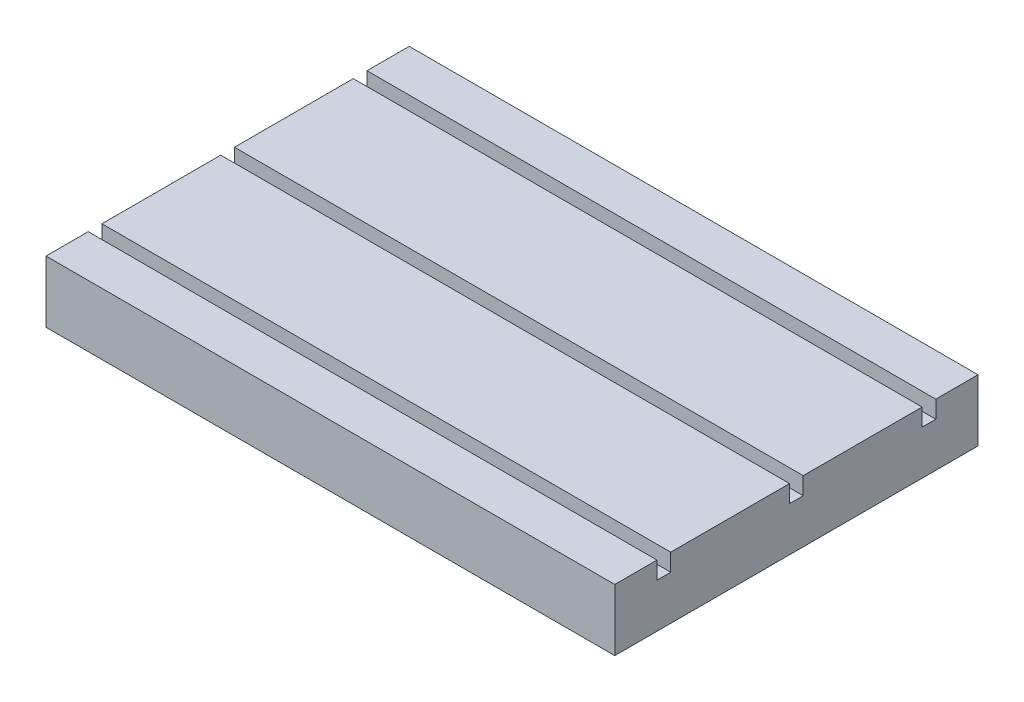
ISO-10303-21;
HEADER;
FILE_DESCRIPTION(('STEP AP214'),'2;1');
FILE_NAME('part.step','',(''),(''),'','','');
FILE_SCHEMA(('AUTOMOTIVE_DESIGN { 1 0 10303 214 1 1 1 1 }'));
ENDSEC;
DATA;
#1=APPLICATION_CONTEXT('core data for automotive mechanical design processes');
#2=APPLICATION_PROTOCOL_DEFINITION('international standard','automotive_design',2000,#1);
#3=PRODUCT_CONTEXT('',#1,'mechanical');
#4=PRODUCT('Part','Part','',(#3));
#5=PRODUCT_RELATED_PRODUCT_CATEGORY('part','',(#4));
#6=PRODUCT_DEFINITION_FORMATION('','',#4);
#7=PRODUCT_DEFINITION_CONTEXT('part definition',#1,'design');
#8=PRODUCT_DEFINITION('design','',#6,#7);
#9=PRODUCT_DEFINITION_SHAPE('','',#8);
#10=(LENGTH_UNIT() NAMED_UNIT(*) SI_UNIT(.MILLI.,.METRE.));
#11=(NAMED_UNIT(*) PLANE_ANGLE_UNIT() SI_UNIT($,.RADIAN.));
#12=(NAMED_UNIT(*) SI_UNIT($,.STERADIAN.) SOLID_ANGLE_UNIT());
#13=UNCERTAINTY_MEASURE_WITH_UNIT(LENGTH_MEASURE(1.E-05),#10,'distance_accuracy_value','');
#14=(GEOMETRIC_REPRESENTATION_CONTEXT(3) GLOBAL_UNCERTAINTY_ASSIGNED_CONTEXT((#13)) GLOBAL_UNIT_ASSIGNED_CONTEXT((#10,
#11,#12)) REPRESENTATION_CONTEXT('',''));
#15=CARTESIAN_POINT('',(0.,0.,0.));
#16=DIRECTION('',(0.,0.,1.));
#17=DIRECTION('',(1.,0.,0.));
#18=AXIS2_PLACEMENT_3D('',#15,#16,#17);
#19=CARTESIAN_POINT('',(0.,9.,0.));
#20=DIRECTION('',(1.,0.,0.));
#21=DIRECTION('',(0.,0.,-1.));
#22=AXIS2_PLACEMENT_3D('',#19,#20,#21);
#23=PLANE('',#22);
#24=DIRECTION('',(0.,1.,0.));
#25=VECTOR('',#24,1.);
#26=CARTESIAN_POINT('',(0.,6.46,25.5));
#27=LINE('',#26,#25);
#28=CARTESIAN_POINT('',(0.,6.46,25.5));
#29=VERTEX_POINT('',#28);
#30=CARTESIAN_POINT('',(0.,9.,25.5));
#31=VERTEX_POINT('',#30);
#32=EDGE_CURVE('E255',#29,#31,#27,.T.);
#33=ORIENTED_EDGE('',*,*,#32,.T.);
#34=DIRECTION('',(0.,0.,1.));
#35=VECTOR('',#34,1.);
#36=CARTESIAN_POINT('',(0.,9.,0.));
#37=LINE('',#36,#35);
#38=CARTESIAN_POINT('',(0.,9.,8.15934037097278));
#39=VERTEX_POINT('',#38);
#40=EDGE_CURVE('E190',#39,#31,#37,.T.);
#41=ORIENTED_EDGE('',*,*,#40,.F.);
#42=DIRECTION('',(0.,1.,0.));
#43=VECTOR('',#42,1.);
#44=CARTESIAN_POINT('',(0.,6.46,8.15934037097278));
#45=LINE('',#44,#43);
#46=CARTESIAN_POINT('',(0.,6.46,8.15934037097278));
#47=VERTEX_POINT('',#46);
#48=EDGE_CURVE('E57',#47,#39,#45,.T.);
#49=ORIENTED_EDGE('',*,*,#48,.F.);
#50=DIRECTION('',(0.,0.,1.));
#51=VECTOR('',#50,1.);
#52=CARTESIAN_POINT('',(0.,6.46,6.15934037097278));
#53=LINE('',#52,#51);
#54=CARTESIAN_POINT('',(0.,6.46,6.15934037097278));
#55=VERTEX_POINT('',#54);
#56=EDGE_CURVE('E221',#55,#47,#53,.T.);
#57=ORIENTED_EDGE('',*,*,#56,.F.);
#58=DIRECTION('',(0.,1.,0.));
#59=VECTOR('',#58,1.);
#60=CARTESIAN_POINT('',(0.,6.46,6.15934037097278));
#61=LINE('',#60,#59);
#62=CARTESIAN_POINT('',(0.,9.,6.15934037097278));
#63=VERTEX_POINT('',#62);
#64=EDGE_CURVE('E235',#55,#63,#61,.T.);
#65=ORIENTED_EDGE('',*,*,#64,.T.);
#66=CARTESIAN_POINT('',(0.,9.,0.));
#67=VERTEX_POINT('',#66);
#68=EDGE_CURVE('E185',#67,#63,#37,.T.);
#69=ORIENTED_EDGE('',*,*,#68,.F.);
#70=DIRECTION('',(0.,-1.,0.));
#71=VECTOR('',#70,1.);
#72=CARTESIAN_POINT('',(0.,9.,0.));
#73=LINE('',#72,#71);
#74=CARTESIAN_POINT('',(0.,0.,0.));
#75=VERTEX_POINT('',#74);
#76=EDGE_CURVE('E279',#67,#75,#73,.T.);
#77=ORIENTED_EDGE('',*,*,#76,.T.);
#78=DIRECTION('',(0.,0.,1.));
#79=VECTOR('',#78,1.);
#80=CARTESIAN_POINT('',(0.,0.,0.));
#81=LINE('',#80,#79);
#82=CARTESIAN_POINT('',(0.,0.,53.));
#83=VERTEX_POINT('',#82);
#84=EDGE_CURVE('E198',#75,#83,#81,.T.);
#85=ORIENTED_EDGE('',*,*,#84,.T.);
#86=DIRECTION('',(0.,-1.,0.));
#87=VECTOR('',#86,1.);
#88=CARTESIAN_POINT('',(0.,9.,53.));
#89=LINE('',#88,#87);
#90=CARTESIAN_POINT('',(0.,9.,53.));
#91=VERTEX_POINT('',#90);
#92=EDGE_CURVE('E11',#91,#83,#89,.T.);
#93=ORIENTED_EDGE('',*,*,#92,.F.);
#94=CARTESIAN_POINT('',(0.,9.,46.8406596290272));
#95=VERTEX_POINT('',#94);
#96=EDGE_CURVE('E193',#95,#91,#37,.T.);
#97=ORIENTED_EDGE('',*,*,#96,.F.);
#98=DIRECTION('',(0.,1.,0.));
#99=VECTOR('',#98,1.);
#100=CARTESIAN_POINT('',(0.,6.46,46.8406596290272));
#101=LINE('',#100,#99);
#102=CARTESIAN_POINT('',(0.,6.46,46.8406596290272));
#103=VERTEX_POINT('',#102);
#104=EDGE_CURVE('E204',#103,#95,#101,.T.);
#105=ORIENTED_EDGE('',*,*,#104,.F.);
#106=DIRECTION('',(0.,0.,-1.));
#107=VECTOR('',#106,1.);
#108=CARTESIAN_POINT('',(0.,6.46,46.8406596290272));
#109=LINE('',#108,#107);
#110=CARTESIAN_POINT('',(0.,6.46,44.8406596290272));
#111=VERTEX_POINT('',#110);
#112=EDGE_CURVE('E209',#103,#111,#109,.T.);
#113=ORIENTED_EDGE('',*,*,#112,.T.);
#114=DIRECTION('',(0.,1.,0.));
#115=VECTOR('',#114,1.);
#116=CARTESIAN_POINT('',(0.,6.46,44.8406596290272));
#117=LINE('',#116,#115);
#118=CARTESIAN_POINT('',(0.,9.,44.8406596290272));
#119=VERTEX_POINT('',#118);
#120=EDGE_CURVE('E195',#111,#119,#117,.T.);
#121=ORIENTED_EDGE('',*,*,#120,.T.);
#122=CARTESIAN_POINT('',(0.,9.,27.5));
#123=VERTEX_POINT('',#122);
#124=EDGE_CURVE('E192',#123,#119,#37,.T.);
#125=ORIENTED_EDGE('',*,*,#124,.F.);
#126=DIRECTION('',(0.,1.,0.));
#127=VECTOR('',#126,1.);
#128=CARTESIAN_POINT('',(0.,6.46,27.5));
#129=LINE('',#128,#127);
#130=CARTESIAN_POINT('',(0.,6.46,27.5));
#131=VERTEX_POINT('',#130);
#132=EDGE_CURVE('E49',#131,#123,#129,.T.);
#133=ORIENTED_EDGE('',*,*,#132,.F.);
#134=DIRECTION('',(0.,0.,-1.));
#135=VECTOR('',#134,1.);
#136=CARTESIAN_POINT('',(0.,6.46,27.5));
#137=LINE('',#136,#135);
#138=EDGE_CURVE('E155',#131,#29,#137,.T.);
#139=ORIENTED_EDGE('',*,*,#138,.T.);
#140=EDGE_LOOP('',(#33,#41,#49,#57,#65,#69,#77,#85,#93,#97,#105,#113,#121,#125,#133,#139));
#141=FACE_BOUND('',#140,.T.);
#142=ADVANCED_FACE('F35',(#141),#23,.F.);
#143=CARTESIAN_POINT('',(83.,9.,0.));
#144=DIRECTION('',(-1.,0.,0.));
#145=DIRECTION('',(0.,0.,1.));
#146=AXIS2_PLACEMENT_3D('',#143,#144,#145);
#147=PLANE('',#146);
#148=DIRECTION('',(0.,1.,0.));
#149=VECTOR('',#148,1.);
#150=CARTESIAN_POINT('',(83.,6.46,25.5));
#151=LINE('',#150,#149);
#152=CARTESIAN_POINT('',(83.,6.46,25.5));
#153=VERTEX_POINT('',#152);
#154=CARTESIAN_POINT('',(83.,9.,25.5));
#155=VERTEX_POINT('',#154);
#156=EDGE_CURVE('E166',#153,#155,#151,.T.);
#157=ORIENTED_EDGE('',*,*,#156,.F.);
#158=DIRECTION('',(0.,0.,-1.));
#159=VECTOR('',#158,1.);
#160=CARTESIAN_POINT('',(83.,6.46,26.5));
#161=LINE('',#160,#159);
#162=CARTESIAN_POINT('',(82.9999999999999,6.46,27.5));
#163=VERTEX_POINT('',#162);
#164=EDGE_CURVE('E165',#163,#153,#161,.T.);
#165=ORIENTED_EDGE('',*,*,#164,.F.);
#166=DIRECTION('',(0.,1.,0.));
#167=VECTOR('',#166,1.);
#168=CARTESIAN_POINT('',(82.9999999999999,6.46,27.5));
#169=LINE('',#168,#167);
#170=CARTESIAN_POINT('',(82.9999999999999,9.,27.5));
#171=VERTEX_POINT('',#170);
#172=EDGE_CURVE('E149',#163,#171,#169,.T.);
#173=ORIENTED_EDGE('',*,*,#172,.T.);
#174=DIRECTION('',(0.,0.,-1.));
#175=VECTOR('',#174,1.);
#176=CARTESIAN_POINT('',(83.,9.,0.));
#177=LINE('',#176,#175);
#178=CARTESIAN_POINT('',(82.9999999999999,9.,44.8406596290272));
#179=VERTEX_POINT('',#178);
#180=EDGE_CURVE('E163',#179,#171,#177,.T.);
#181=ORIENTED_EDGE('',*,*,#180,.F.);
#182=DIRECTION('',(0.,1.,0.));
#183=VECTOR('',#182,1.);
#184=CARTESIAN_POINT('',(82.9999999999999,6.46,44.8406596290272));
#185=LINE('',#184,#183);
#186=CARTESIAN_POINT('',(82.9999999999999,6.46,44.8406596290272));
#187=VERTEX_POINT('',#186);
#188=EDGE_CURVE('E199',#187,#179,#185,.T.);
#189=ORIENTED_EDGE('',*,*,#188,.F.);
#190=DIRECTION('',(0.,0.,-1.));
#191=VECTOR('',#190,1.);
#192=CARTESIAN_POINT('',(82.9999999999999,6.46,46.8406596290272));
#193=LINE('',#192,#191);
#194=CARTESIAN_POINT('',(82.9999999999999,6.46,46.8406596290272));
#195=VERTEX_POINT('',#194);
#196=EDGE_CURVE('E214',#195,#187,#193,.T.);
#197=ORIENTED_EDGE('',*,*,#196,.F.);
#198=DIRECTION('',(0.,1.,0.));
#199=VECTOR('',#198,1.);
#200=CARTESIAN_POINT('',(82.9999999999999,6.46,46.8406596290272));
#201=LINE('',#200,#199);
#202=CARTESIAN_POINT('',(82.9999999999999,9.,46.8406596290272));
#203=VERTEX_POINT('',#202);
#204=EDGE_CURVE('E201',#195,#203,#201,.T.);
#205=ORIENTED_EDGE('',*,*,#204,.T.);
#206=CARTESIAN_POINT('',(83.,9.,53.));
#207=VERTEX_POINT('',#206);
#208=EDGE_CURVE('E172',#207,#203,#177,.T.);
#209=ORIENTED_EDGE('',*,*,#208,.F.);
#210=DIRECTION('',(0.,-1.,0.));
#211=VECTOR('',#210,1.);
#212=CARTESIAN_POINT('',(83.,9.,53.));
#213=LINE('',#212,#211);
#214=CARTESIAN_POINT('',(83.,0.,53.));
#215=VERTEX_POINT('',#214);
#216=EDGE_CURVE('E42',#207,#215,#213,.T.);
#217=ORIENTED_EDGE('',*,*,#216,.T.);
#218=DIRECTION('',(0.,0.,-1.));
#219=VECTOR('',#218,1.);
#220=CARTESIAN_POINT('',(83.,0.,0.));
#221=LINE('',#220,#219);
#222=CARTESIAN_POINT('',(83.,0.,0.));
#223=VERTEX_POINT('',#222);
#224=EDGE_CURVE('E268',#215,#223,#221,.T.);
#225=ORIENTED_EDGE('',*,*,#224,.T.);
#226=DIRECTION('',(0.,-1.,0.));
#227=VECTOR('',#226,1.);
#228=CARTESIAN_POINT('',(83.,9.,0.));
#229=LINE('',#228,#227);
#230=CARTESIAN_POINT('',(83.,9.,0.));
#231=VERTEX_POINT('',#230);
#232=EDGE_CURVE('E281',#231,#223,#229,.T.);
#233=ORIENTED_EDGE('',*,*,#232,.F.);
#234=CARTESIAN_POINT('',(83.,9.,6.15934037097278));
#235=VERTEX_POINT('',#234);
#236=EDGE_CURVE('E175',#235,#231,#177,.T.);
#237=ORIENTED_EDGE('',*,*,#236,.F.);
#238=DIRECTION('',(0.,1.,0.));
#239=VECTOR('',#238,1.);
#240=CARTESIAN_POINT('',(83.,6.46,6.15934037097278));
#241=LINE('',#240,#239);
#242=CARTESIAN_POINT('',(83.,6.46,6.15934037097278));
#243=VERTEX_POINT('',#242);
#244=EDGE_CURVE('E238',#243,#235,#241,.T.);
#245=ORIENTED_EDGE('',*,*,#244,.F.);
#246=DIRECTION('',(0.,0.,1.));
#247=VECTOR('',#246,1.);
#248=CARTESIAN_POINT('',(83.,6.46,6.15934037097278));
#249=LINE('',#248,#247);
#250=CARTESIAN_POINT('',(83.,6.46,8.15934037097278));
#251=VERTEX_POINT('',#250);
#252=EDGE_CURVE('E228',#243,#251,#249,.T.);
#253=ORIENTED_EDGE('',*,*,#252,.T.);
#254=DIRECTION('',(0.,1.,0.));
#255=VECTOR('',#254,1.);
#256=CARTESIAN_POINT('',(83.,6.46,8.15934037097278));
#257=LINE('',#256,#255);
#258=CARTESIAN_POINT('',(83.,9.,8.15934037097278));
#259=VERTEX_POINT('',#258);
#260=EDGE_CURVE('E240',#251,#259,#257,.T.);
#261=ORIENTED_EDGE('',*,*,#260,.T.);
#262=EDGE_CURVE('E173',#155,#259,#177,.T.);
#263=ORIENTED_EDGE('',*,*,#262,.F.);
#264=EDGE_LOOP('',(#157,#165,#173,#181,#189,#197,#205,#209,#217,#225,#233,#237,#245,#253,#261,#263));
#265=FACE_BOUND('',#264,.T.);
#266=ADVANCED_FACE('F161',(#265),#147,.F.);
#267=CARTESIAN_POINT('',(0.,9.,0.));
#268=DIRECTION('',(0.,1.,0.));
#269=DIRECTION('',(0.,0.,1.));
#270=AXIS2_PLACEMENT_3D('',#267,#268,#269);
#271=PLANE('',#270);
#272=ORIENTED_EDGE('',*,*,#40,.T.);
#273=DIRECTION('',(1.,0.,0.));
#274=VECTOR('',#273,1.);
#275=CARTESIAN_POINT('',(0.,9.,25.5));
#276=LINE('',#275,#274);
#277=EDGE_CURVE('E154',#31,#155,#276,.T.);
#278=ORIENTED_EDGE('',*,*,#277,.T.);
#279=ORIENTED_EDGE('',*,*,#262,.T.);
#280=DIRECTION('',(1.,0.,0.));
#281=VECTOR('',#280,1.);
#282=CARTESIAN_POINT('',(0.,9.,8.15934037097278));
#283=LINE('',#282,#281);
#284=EDGE_CURVE('E211',#39,#259,#283,.T.);
#285=ORIENTED_EDGE('',*,*,#284,.F.);
#286=EDGE_LOOP('',(#272,#278,#279,#285));
#287=FACE_BOUND('',#286,.T.);
#288=ADVANCED_FACE('F263',(#287),#271,.T.);
#289=ORIENTED_EDGE('',*,*,#68,.T.);
#290=DIRECTION('',(1.,0.,0.));
#291=VECTOR('',#290,1.);
#292=CARTESIAN_POINT('',(0.,9.,6.15934037097278));
#293=LINE('',#292,#291);
#294=EDGE_CURVE('E224',#63,#235,#293,.T.);
#295=ORIENTED_EDGE('',*,*,#294,.T.);
#296=ORIENTED_EDGE('',*,*,#236,.T.);
#297=DIRECTION('',(-1.,0.,0.));
#298=VECTOR('',#297,1.);
#299=CARTESIAN_POINT('',(0.,9.,0.));
#300=LINE('',#299,#298);
#301=EDGE_CURVE('E177',#231,#67,#300,.T.);
#302=ORIENTED_EDGE('',*,*,#301,.T.);
#303=EDGE_LOOP('',(#289,#295,#296,#302));
#304=FACE_BOUND('',#303,.T.);
#305=ADVANCED_FACE('F293',(#304),#271,.T.);
#306=DIRECTION('',(1.,0.,0.));
#307=VECTOR('',#306,1.);
#308=CARTESIAN_POINT('',(0.,9.,27.5));
#309=LINE('',#308,#307);
#310=EDGE_CURVE('E146',#123,#171,#309,.T.);
#311=ORIENTED_EDGE('',*,*,#310,.F.);
#312=ORIENTED_EDGE('',*,*,#124,.T.);
#313=DIRECTION('',(1.,0.,0.));
#314=VECTOR('',#313,1.);
#315=CARTESIAN_POINT('',(0.,9.,44.8406596290272));
#316=LINE('',#315,#314);
#317=EDGE_CURVE('E171',#119,#179,#316,.T.);
#318=ORIENTED_EDGE('',*,*,#317,.T.);
#319=ORIENTED_EDGE('',*,*,#180,.T.);
#320=EDGE_LOOP('',(#311,#312,#318,#319));
#321=FACE_BOUND('',#320,.T.);
#322=ADVANCED_FACE('F169',(#321),#271,.T.);
#323=CARTESIAN_POINT('',(0.,9.,53.));
#324=DIRECTION('',(0.,0.,-1.));
#325=DIRECTION('',(-1.,0.,0.));
#326=AXIS2_PLACEMENT_3D('',#323,#324,#325);
#327=PLANE('',#326);
#328=DIRECTION('',(1.,0.,0.));
#329=VECTOR('',#328,1.);
#330=CARTESIAN_POINT('',(0.,0.,53.));
#331=LINE('',#330,#329);
#332=EDGE_CURVE('E275',#83,#215,#331,.T.);
#333=ORIENTED_EDGE('',*,*,#332,.T.);
#334=ORIENTED_EDGE('',*,*,#216,.F.);
#335=DIRECTION('',(1.,0.,0.));
#336=VECTOR('',#335,1.);
#337=CARTESIAN_POINT('',(0.,9.,53.));
#338=LINE('',#337,#336);
#339=EDGE_CURVE('E180',#91,#207,#338,.T.);
#340=ORIENTED_EDGE('',*,*,#339,.F.);
#341=ORIENTED_EDGE('',*,*,#92,.T.);
#342=EDGE_LOOP('',(#333,#334,#340,#341));
#343=FACE_BOUND('',#342,.T.);
#344=ADVANCED_FACE('F328',(#343),#327,.F.);
#345=CARTESIAN_POINT('',(0.,9.,0.));
#346=DIRECTION('',(0.,0.,1.));
#347=DIRECTION('',(1.,0.,0.));
#348=AXIS2_PLACEMENT_3D('',#345,#346,#347);
#349=PLANE('',#348);
#350=DIRECTION('',(-1.,0.,0.));
#351=VECTOR('',#350,1.);
#352=CARTESIAN_POINT('',(0.,0.,0.));
#353=LINE('',#352,#351);
#354=EDGE_CURVE('E265',#223,#75,#353,.T.);
#355=ORIENTED_EDGE('',*,*,#354,.T.);
#356=ORIENTED_EDGE('',*,*,#76,.F.);
#357=ORIENTED_EDGE('',*,*,#301,.F.);
#358=ORIENTED_EDGE('',*,*,#232,.T.);
#359=EDGE_LOOP('',(#355,#356,#357,#358));
#360=FACE_BOUND('',#359,.T.);
#361=ADVANCED_FACE('F295',(#360),#349,.F.);
#362=DIRECTION('',(1.,0.,0.));
#363=VECTOR('',#362,1.);
#364=CARTESIAN_POINT('',(0.,9.,46.8406596290272));
#365=LINE('',#364,#363);
#366=EDGE_CURVE('E207',#95,#203,#365,.T.);
#367=ORIENTED_EDGE('',*,*,#366,.F.);
#368=ORIENTED_EDGE('',*,*,#96,.T.);
#369=ORIENTED_EDGE('',*,*,#339,.T.);
#370=ORIENTED_EDGE('',*,*,#208,.T.);
#371=EDGE_LOOP('',(#367,#368,#369,#370));
#372=FACE_BOUND('',#371,.T.);
#373=ADVANCED_FACE('F325',(#372),#271,.T.);
#374=CARTESIAN_POINT('',(0.,0.,0.));
#375=DIRECTION('',(0.,1.,0.));
#376=DIRECTION('',(0.,0.,1.));
#377=AXIS2_PLACEMENT_3D('',#374,#375,#376);
#378=PLANE('',#377);
#379=ORIENTED_EDGE('',*,*,#84,.F.);
#380=ORIENTED_EDGE('',*,*,#354,.F.);
#381=ORIENTED_EDGE('',*,*,#224,.F.);
#382=ORIENTED_EDGE('',*,*,#332,.F.);
#383=EDGE_LOOP('',(#379,#380,#381,#382));
#384=FACE_BOUND('',#383,.T.);
#385=ADVANCED_FACE('F288',(#384),#378,.F.);
#386=CARTESIAN_POINT('',(0.,6.46,44.8406596290272));
#387=DIRECTION('',(0.,0.,1.));
#388=DIRECTION('',(1.,0.,0.));
#389=AXIS2_PLACEMENT_3D('',#386,#387,#388);
#390=PLANE('',#389);
#391=ORIENTED_EDGE('',*,*,#317,.F.);
#392=ORIENTED_EDGE('',*,*,#120,.F.);
#393=DIRECTION('',(1.,0.,0.));
#394=VECTOR('',#393,1.);
#395=CARTESIAN_POINT('',(0.,6.46,44.8406596290272));
#396=LINE('',#395,#394);
#397=EDGE_CURVE('E217',#111,#187,#396,.T.);
#398=ORIENTED_EDGE('',*,*,#397,.T.);
#399=ORIENTED_EDGE('',*,*,#188,.T.);
#400=EDGE_LOOP('',(#391,#392,#398,#399));
#401=FACE_BOUND('',#400,.T.);
#402=ADVANCED_FACE('F342',(#401),#390,.T.);
#403=CARTESIAN_POINT('',(0.,6.46,46.8406596290272));
#404=DIRECTION('',(0.,0.,1.));
#405=DIRECTION('',(1.,0.,0.));
#406=AXIS2_PLACEMENT_3D('',#403,#404,#405);
#407=PLANE('',#406);
#408=ORIENTED_EDGE('',*,*,#366,.T.);
#409=ORIENTED_EDGE('',*,*,#204,.F.);
#410=DIRECTION('',(1.,0.,0.));
#411=VECTOR('',#410,1.);
#412=CARTESIAN_POINT('',(0.,6.46,46.8406596290272));
#413=LINE('',#412,#411);
#414=EDGE_CURVE('E206',#103,#195,#413,.T.);
#415=ORIENTED_EDGE('',*,*,#414,.F.);
#416=ORIENTED_EDGE('',*,*,#104,.T.);
#417=EDGE_LOOP('',(#408,#409,#415,#416));
#418=FACE_BOUND('',#417,.T.);
#419=ADVANCED_FACE('F337',(#418),#407,.F.);
#420=CARTESIAN_POINT('',(0.,6.46,0.));
#421=DIRECTION('',(0.,-1.,0.));
#422=DIRECTION('',(0.,0.,-1.));
#423=AXIS2_PLACEMENT_3D('',#420,#421,#422);
#424=PLANE('',#423);
#425=ORIENTED_EDGE('',*,*,#112,.F.);
#426=ORIENTED_EDGE('',*,*,#414,.T.);
#427=ORIENTED_EDGE('',*,*,#196,.T.);
#428=ORIENTED_EDGE('',*,*,#397,.F.);
#429=EDGE_LOOP('',(#425,#426,#427,#428));
#430=FACE_BOUND('',#429,.T.);
#431=ADVANCED_FACE('F313',(#430),#424,.F.);
#432=CARTESIAN_POINT('',(0.,6.46,6.15934037097278));
#433=DIRECTION('',(0.,0.,1.));
#434=DIRECTION('',(1.,0.,0.));
#435=AXIS2_PLACEMENT_3D('',#432,#433,#434);
#436=PLANE('',#435);
#437=ORIENTED_EDGE('',*,*,#294,.F.);
#438=ORIENTED_EDGE('',*,*,#64,.F.);
#439=DIRECTION('',(1.,0.,0.));
#440=VECTOR('',#439,1.);
#441=CARTESIAN_POINT('',(0.,6.46,6.15934037097278));
#442=LINE('',#441,#440);
#443=EDGE_CURVE('E231',#55,#243,#442,.T.);
#444=ORIENTED_EDGE('',*,*,#443,.T.);
#445=ORIENTED_EDGE('',*,*,#244,.T.);
#446=EDGE_LOOP('',(#437,#438,#444,#445));
#447=FACE_BOUND('',#446,.T.);
#448=ADVANCED_FACE('F299',(#447),#436,.T.);
#449=CARTESIAN_POINT('',(0.,6.46,8.15934037097278));
#450=DIRECTION('',(0.,0.,1.));
#451=DIRECTION('',(1.,0.,0.));
#452=AXIS2_PLACEMENT_3D('',#449,#450,#451);
#453=PLANE('',#452);
#454=ORIENTED_EDGE('',*,*,#284,.T.);
#455=ORIENTED_EDGE('',*,*,#260,.F.);
#456=DIRECTION('',(1.,0.,0.));
#457=VECTOR('',#456,1.);
#458=CARTESIAN_POINT('',(0.,6.46,8.15934037097278));
#459=LINE('',#458,#457);
#460=EDGE_CURVE('E225',#47,#251,#459,.T.);
#461=ORIENTED_EDGE('',*,*,#460,.F.);
#462=ORIENTED_EDGE('',*,*,#48,.T.);
#463=EDGE_LOOP('',(#454,#455,#461,#462));
#464=FACE_BOUND('',#463,.T.);
#465=ADVANCED_FACE('F304',(#464),#453,.F.);
#466=CARTESIAN_POINT('',(0.,6.46,0.));
#467=DIRECTION('',(0.,1.,0.));
#468=DIRECTION('',(0.,0.,1.));
#469=AXIS2_PLACEMENT_3D('',#466,#467,#468);
#470=PLANE('',#469);
#471=ORIENTED_EDGE('',*,*,#56,.T.);
#472=ORIENTED_EDGE('',*,*,#460,.T.);
#473=ORIENTED_EDGE('',*,*,#252,.F.);
#474=ORIENTED_EDGE('',*,*,#443,.F.);
#475=EDGE_LOOP('',(#471,#472,#473,#474));
#476=FACE_BOUND('',#475,.T.);
#477=ADVANCED_FACE('F302',(#476),#470,.T.);
#478=CARTESIAN_POINT('',(0.,6.46,25.5));
#479=DIRECTION('',(0.,0.,1.));
#480=DIRECTION('',(1.,0.,0.));
#481=AXIS2_PLACEMENT_3D('',#478,#479,#480);
#482=PLANE('',#481);
#483=ORIENTED_EDGE('',*,*,#277,.F.);
#484=ORIENTED_EDGE('',*,*,#32,.F.);
#485=DIRECTION('',(1.,0.,0.));
#486=VECTOR('',#485,1.);
#487=CARTESIAN_POINT('',(0.,6.46,25.5));
#488=LINE('',#487,#486);
#489=EDGE_CURVE('E246',#29,#153,#488,.T.);
#490=ORIENTED_EDGE('',*,*,#489,.T.);
#491=ORIENTED_EDGE('',*,*,#156,.T.);
#492=EDGE_LOOP('',(#483,#484,#490,#491));
#493=FACE_BOUND('',#492,.T.);
#494=ADVANCED_FACE('F311',(#493),#482,.T.);
#495=CARTESIAN_POINT('',(0.,6.46,27.5));
#496=DIRECTION('',(0.,0.,1.));
#497=DIRECTION('',(1.,0.,0.));
#498=AXIS2_PLACEMENT_3D('',#495,#496,#497);
#499=PLANE('',#498);
#500=ORIENTED_EDGE('',*,*,#310,.T.);
#501=ORIENTED_EDGE('',*,*,#172,.F.);
#502=DIRECTION('',(1.,0.,0.));
#503=VECTOR('',#502,1.);
#504=CARTESIAN_POINT('',(0.,6.46,27.5));
#505=LINE('',#504,#503);
#506=EDGE_CURVE('E249',#131,#163,#505,.T.);
#507=ORIENTED_EDGE('',*,*,#506,.F.);
#508=ORIENTED_EDGE('',*,*,#132,.T.);
#509=EDGE_LOOP('',(#500,#501,#507,#508));
#510=FACE_BOUND('',#509,.T.);
#511=ADVANCED_FACE('F148',(#510),#499,.F.);
#512=CARTESIAN_POINT('',(0.,6.46,0.));
#513=DIRECTION('',(0.,-1.,0.));
#514=DIRECTION('',(0.,0.,-1.));
#515=AXIS2_PLACEMENT_3D('',#512,#513,#514);
#516=PLANE('',#515);
#517=ORIENTED_EDGE('',*,*,#138,.F.);
#518=ORIENTED_EDGE('',*,*,#506,.T.);
#519=ORIENTED_EDGE('',*,*,#164,.T.);
#520=ORIENTED_EDGE('',*,*,#489,.F.);
#521=EDGE_LOOP('',(#517,#518,#519,#520));
#522=FACE_BOUND('',#521,.T.);
#523=ADVANCED_FACE('F388',(#522),#516,.F.);
#524=CLOSED_SHELL('',(#142,#266,#288,#305,#322,#344,#361,#373,#385,#402,#419,#431,#448,#465,
#477,#494,#511,#523));
#525=MANIFOLD_SOLID_BREP('B2',#524);
#526=ADVANCED_BREP_SHAPE_REPRESENTATION('',(#18,#525),#14);
#527=SHAPE_DEFINITION_REPRESENTATION(#9,#526);
ENDSEC;
END-ISO-10303-21;
